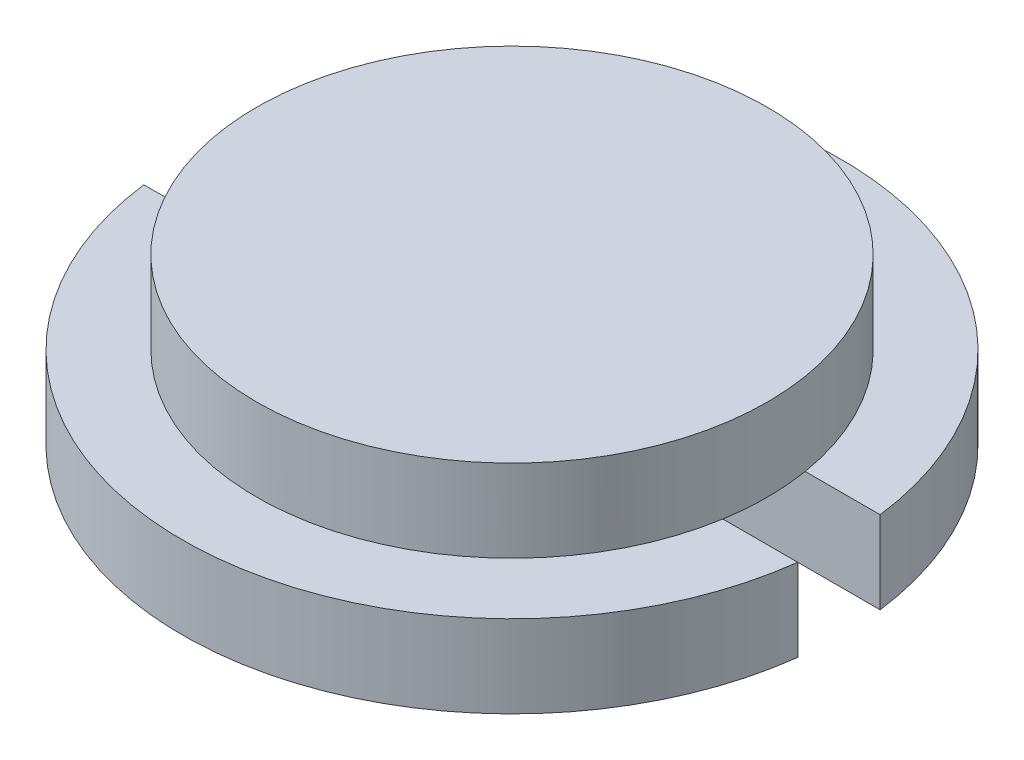
ISO-10303-21;
HEADER;
FILE_DESCRIPTION(('STEP AP214'),'2;1');
FILE_NAME('part.step','',(''),(''),'','','');
FILE_SCHEMA(('AUTOMOTIVE_DESIGN { 1 0 10303 214 1 1 1 1 }'));
ENDSEC;
DATA;
#1=APPLICATION_CONTEXT('core data for automotive mechanical design processes');
#2=APPLICATION_PROTOCOL_DEFINITION('international standard','automotive_design',2000,#1);
#3=PRODUCT_CONTEXT('',#1,'mechanical');
#4=PRODUCT('Part','Part','',(#3));
#5=PRODUCT_RELATED_PRODUCT_CATEGORY('part','',(#4));
#6=PRODUCT_DEFINITION_FORMATION('','',#4);
#7=PRODUCT_DEFINITION_CONTEXT('part definition',#1,'design');
#8=PRODUCT_DEFINITION('design','',#6,#7);
#9=PRODUCT_DEFINITION_SHAPE('','',#8);
#10=(LENGTH_UNIT() NAMED_UNIT(*) SI_UNIT(.MILLI.,.METRE.));
#11=(NAMED_UNIT(*) PLANE_ANGLE_UNIT() SI_UNIT($,.RADIAN.));
#12=(NAMED_UNIT(*) SI_UNIT($,.STERADIAN.) SOLID_ANGLE_UNIT());
#13=UNCERTAINTY_MEASURE_WITH_UNIT(LENGTH_MEASURE(1.E-05),#10,'distance_accuracy_value','');
#14=(GEOMETRIC_REPRESENTATION_CONTEXT(3) GLOBAL_UNCERTAINTY_ASSIGNED_CONTEXT((#13)) GLOBAL_UNIT_ASSIGNED_CONTEXT((#10,
#11,#12)) REPRESENTATION_CONTEXT('',''));
#15=CARTESIAN_POINT('',(0.,0.,0.));
#16=DIRECTION('',(0.,0.,1.));
#17=DIRECTION('',(1.,0.,0.));
#18=AXIS2_PLACEMENT_3D('',#15,#16,#17);
#19=CARTESIAN_POINT('',(0.,0.,0.));
#20=DIRECTION('',(0.,-1.,0.));
#21=DIRECTION('',(0.,0.,-1.));
#22=AXIS2_PLACEMENT_3D('',#19,#20,#21);
#23=PLANE('',#22);
#24=CARTESIAN_POINT('',(0.,0.,0.));
#25=DIRECTION('',(0.,-1.,0.));
#26=DIRECTION('',(0.,0.,-1.));
#27=AXIS2_PLACEMENT_3D('',#24,#25,#26);
#28=CIRCLE('',#27,40.);
#29=CARTESIAN_POINT('',(-39.6862696659689,0.,-5.));
#30=VERTEX_POINT('',#29);
#31=CARTESIAN_POINT('',(39.6862696659689,0.,-5.));
#32=VERTEX_POINT('',#31);
#33=EDGE_CURVE('E163',#30,#32,#28,.T.);
#34=ORIENTED_EDGE('',*,*,#33,.F.);
#35=DIRECTION('',(1.,0.,0.));
#36=VECTOR('',#35,1.);
#37=CARTESIAN_POINT('',(-39.6862696659689,0.,-5.));
#38=LINE('',#37,#36);
#39=CARTESIAN_POINT('',(-30.5941170815567,0.,-5.));
#40=VERTEX_POINT('',#39);
#41=EDGE_CURVE('E166',#30,#40,#38,.T.);
#42=ORIENTED_EDGE('',*,*,#41,.T.);
#43=CARTESIAN_POINT('',(0.,0.,0.));
#44=DIRECTION('',(0.,-1.,0.));
#45=DIRECTION('',(0.,0.,-1.));
#46=AXIS2_PLACEMENT_3D('',#43,#44,#45);
#47=CIRCLE('',#46,31.);
#48=CARTESIAN_POINT('',(30.5941170815567,0.,-5.));
#49=VERTEX_POINT('',#48);
#50=EDGE_CURVE('E179',#40,#49,#47,.T.);
#51=ORIENTED_EDGE('',*,*,#50,.T.);
#52=DIRECTION('',(1.,0.,0.));
#53=VECTOR('',#52,1.);
#54=CARTESIAN_POINT('',(22.5,0.,-5.));
#55=LINE('',#54,#53);
#56=EDGE_CURVE('E251',#49,#32,#55,.T.);
#57=ORIENTED_EDGE('',*,*,#56,.T.);
#58=EDGE_LOOP('',(#34,#42,#51,#57));
#59=FACE_BOUND('',#58,.T.);
#60=ADVANCED_FACE('F41',(#59),#23,.F.);
#61=CARTESIAN_POINT('',(0.,-10.,0.));
#62=DIRECTION('',(0.,1.,0.));
#63=DIRECTION('',(0.,0.,1.));
#64=AXIS2_PLACEMENT_3D('',#61,#62,#63);
#65=CYLINDRICAL_SURFACE('',#64,40.);
#66=CARTESIAN_POINT('',(0.,-10.,0.));
#67=DIRECTION('',(0.,-1.,0.));
#68=DIRECTION('',(0.,0.,-1.));
#69=AXIS2_PLACEMENT_3D('',#66,#67,#68);
#70=CIRCLE('',#69,40.);
#71=CARTESIAN_POINT('',(-39.6862696659689,-10.,-5.));
#72=VERTEX_POINT('',#71);
#73=CARTESIAN_POINT('',(39.6862696659689,-10.,-5.));
#74=VERTEX_POINT('',#73);
#75=EDGE_CURVE('E161',#72,#74,#70,.T.);
#76=ORIENTED_EDGE('',*,*,#75,.F.);
#77=DIRECTION('',(0.,1.,0.));
#78=VECTOR('',#77,1.);
#79=CARTESIAN_POINT('',(-39.6862696659689,-10.,-5.));
#80=LINE('',#79,#78);
#81=EDGE_CURVE('E265',#72,#30,#80,.T.);
#82=ORIENTED_EDGE('',*,*,#81,.T.);
#83=ORIENTED_EDGE('',*,*,#33,.T.);
#84=DIRECTION('',(0.,1.,0.));
#85=VECTOR('',#84,1.);
#86=CARTESIAN_POINT('',(39.6862696659689,-10.,-5.));
#87=LINE('',#86,#85);
#88=EDGE_CURVE('E148',#32,#74,#87,.F.);
#89=ORIENTED_EDGE('',*,*,#88,.T.);
#90=EDGE_LOOP('',(#76,#82,#83,#89));
#91=FACE_BOUND('',#90,.T.);
#92=ADVANCED_FACE('F159',(#91),#65,.T.);
#93=CARTESIAN_POINT('',(10.,-5.,10.));
#94=DIRECTION('',(-0.707106781186549,-0.707106781186546,0.));
#95=DIRECTION('',(0.707106781186546,-0.707106781186549,0.));
#96=AXIS2_PLACEMENT_3D('',#93,#94,#95);
#97=PLANE('',#96);
#98=DIRECTION('',(0.707106781186546,-0.707106781186549,0.));
#99=VECTOR('',#98,1.);
#100=CARTESIAN_POINT('',(10.,-5.,-5.));
#101=LINE('',#100,#99);
#102=CARTESIAN_POINT('',(10.,-5.,-5.));
#103=VERTEX_POINT('',#102);
#104=CARTESIAN_POINT('',(15.,-10.,-5.));
#105=VERTEX_POINT('',#104);
#106=EDGE_CURVE('E57',#103,#105,#101,.T.);
#107=ORIENTED_EDGE('',*,*,#106,.F.);
#108=DIRECTION('',(0.,0.,-1.));
#109=VECTOR('',#108,1.);
#110=CARTESIAN_POINT('',(10.,-5.,10.));
#111=LINE('',#110,#109);
#112=CARTESIAN_POINT('',(10.,-5.,5.));
#113=VERTEX_POINT('',#112);
#114=EDGE_CURVE('E209',#113,#103,#111,.T.);
#115=ORIENTED_EDGE('',*,*,#114,.F.);
#116=DIRECTION('',(-0.707106781186546,0.707106781186549,0.));
#117=VECTOR('',#116,1.);
#118=CARTESIAN_POINT('',(10.,-5.,5.));
#119=LINE('',#118,#117);
#120=CARTESIAN_POINT('',(15.,-10.,5.));
#121=VERTEX_POINT('',#120);
#122=EDGE_CURVE('E183',#121,#113,#119,.T.);
#123=ORIENTED_EDGE('',*,*,#122,.F.);
#124=DIRECTION('',(0.,0.,1.));
#125=VECTOR('',#124,1.);
#126=CARTESIAN_POINT('',(15.,-10.,0.));
#127=LINE('',#126,#125);
#128=EDGE_CURVE('E217',#105,#121,#127,.T.);
#129=ORIENTED_EDGE('',*,*,#128,.F.);
#130=EDGE_LOOP('',(#107,#115,#123,#129));
#131=FACE_BOUND('',#130,.T.);
#132=ADVANCED_FACE('F323',(#131),#97,.F.);
#133=CARTESIAN_POINT('',(10.,-5.,10.));
#134=DIRECTION('',(0.,-1.,0.));
#135=DIRECTION('',(1.,0.,0.));
#136=AXIS2_PLACEMENT_3D('',#133,#134,#135);
#137=PLANE('',#136);
#138=DIRECTION('',(1.,0.,0.));
#139=VECTOR('',#138,1.);
#140=CARTESIAN_POINT('',(10.,-5.,-5.));
#141=LINE('',#140,#139);
#142=CARTESIAN_POINT('',(5.00000000000001,-5.00000000000001,-5.));
#143=VERTEX_POINT('',#142);
#144=EDGE_CURVE('E64',#143,#103,#141,.T.);
#145=ORIENTED_EDGE('',*,*,#144,.F.);
#146=DIRECTION('',(0.,0.,-1.));
#147=VECTOR('',#146,1.);
#148=CARTESIAN_POINT('',(5.00000000000001,-5.00000000000001,10.));
#149=LINE('',#148,#147);
#150=CARTESIAN_POINT('',(5.00000000000001,-5.00000000000001,5.));
#151=VERTEX_POINT('',#150);
#152=EDGE_CURVE('E206',#151,#143,#149,.T.);
#153=ORIENTED_EDGE('',*,*,#152,.F.);
#154=DIRECTION('',(-1.,0.,0.));
#155=VECTOR('',#154,1.);
#156=CARTESIAN_POINT('',(10.,-5.,5.));
#157=LINE('',#156,#155);
#158=EDGE_CURVE('E316',#113,#151,#157,.T.);
#159=ORIENTED_EDGE('',*,*,#158,.F.);
#160=ORIENTED_EDGE('',*,*,#114,.T.);
#161=EDGE_LOOP('',(#145,#153,#159,#160));
#162=FACE_BOUND('',#161,.T.);
#163=ADVANCED_FACE('F324',(#162),#137,.F.);
#164=CARTESIAN_POINT('',(5.00000000000001,-5.00000000000001,10.));
#165=DIRECTION('',(-1.,0.,0.));
#166=DIRECTION('',(0.,0.,1.));
#167=AXIS2_PLACEMENT_3D('',#164,#165,#166);
#168=PLANE('',#167);
#169=DIRECTION('',(0.,-1.,0.));
#170=VECTOR('',#169,1.);
#171=CARTESIAN_POINT('',(5.00000000000001,-5.00000000000001,-5.));
#172=LINE('',#171,#170);
#173=CARTESIAN_POINT('',(5.00000000000001,0.,-5.));
#174=VERTEX_POINT('',#173);
#175=EDGE_CURVE('E286',#174,#143,#172,.T.);
#176=ORIENTED_EDGE('',*,*,#175,.F.);
#177=DIRECTION('',(0.,0.,-1.));
#178=VECTOR('',#177,1.);
#179=CARTESIAN_POINT('',(5.00000000000001,0.,10.));
#180=LINE('',#179,#178);
#181=CARTESIAN_POINT('',(5.00000000000001,0.,5.));
#182=VERTEX_POINT('',#181);
#183=EDGE_CURVE('E191',#182,#174,#180,.T.);
#184=ORIENTED_EDGE('',*,*,#183,.F.);
#185=DIRECTION('',(0.,1.,0.));
#186=VECTOR('',#185,1.);
#187=CARTESIAN_POINT('',(5.00000000000001,-5.00000000000001,5.));
#188=LINE('',#187,#186);
#189=EDGE_CURVE('E313',#151,#182,#188,.T.);
#190=ORIENTED_EDGE('',*,*,#189,.F.);
#191=ORIENTED_EDGE('',*,*,#152,.T.);
#192=EDGE_LOOP('',(#176,#184,#190,#191));
#193=FACE_BOUND('',#192,.T.);
#194=ADVANCED_FACE('F326',(#193),#168,.F.);
#195=CARTESIAN_POINT('',(-5.00000000000001,-5.00000000000001,10.));
#196=DIRECTION('',(1.,0.,0.));
#197=DIRECTION('',(0.,0.,-1.));
#198=AXIS2_PLACEMENT_3D('',#195,#196,#197);
#199=PLANE('',#198);
#200=DIRECTION('',(0.,1.,0.));
#201=VECTOR('',#200,1.);
#202=CARTESIAN_POINT('',(-5.00000000000001,-5.00000000000001,-5.));
#203=LINE('',#202,#201);
#204=CARTESIAN_POINT('',(-5.00000000000001,-5.00000000000001,-5.));
#205=VERTEX_POINT('',#204);
#206=CARTESIAN_POINT('',(-5.00000000000001,0.,-5.));
#207=VERTEX_POINT('',#206);
#208=EDGE_CURVE('E282',#205,#207,#203,.T.);
#209=ORIENTED_EDGE('',*,*,#208,.F.);
#210=DIRECTION('',(0.,0.,-1.));
#211=VECTOR('',#210,1.);
#212=CARTESIAN_POINT('',(-5.00000000000001,-5.00000000000001,10.));
#213=LINE('',#212,#211);
#214=CARTESIAN_POINT('',(-5.00000000000001,-5.00000000000001,5.));
#215=VERTEX_POINT('',#214);
#216=EDGE_CURVE('E198',#215,#205,#213,.T.);
#217=ORIENTED_EDGE('',*,*,#216,.F.);
#218=DIRECTION('',(0.,-1.,0.));
#219=VECTOR('',#218,1.);
#220=CARTESIAN_POINT('',(-5.00000000000001,-5.00000000000001,5.));
#221=LINE('',#220,#219);
#222=CARTESIAN_POINT('',(-5.00000000000001,0.,5.));
#223=VERTEX_POINT('',#222);
#224=EDGE_CURVE('E309',#223,#215,#221,.T.);
#225=ORIENTED_EDGE('',*,*,#224,.F.);
#226=DIRECTION('',(0.,0.,-1.));
#227=VECTOR('',#226,1.);
#228=CARTESIAN_POINT('',(-5.00000000000001,0.,10.));
#229=LINE('',#228,#227);
#230=EDGE_CURVE('E202',#223,#207,#229,.T.);
#231=ORIENTED_EDGE('',*,*,#230,.T.);
#232=EDGE_LOOP('',(#209,#217,#225,#231));
#233=FACE_BOUND('',#232,.T.);
#234=ADVANCED_FACE('F328',(#233),#199,.F.);
#235=CARTESIAN_POINT('',(-10.,-5.,10.));
#236=DIRECTION('',(0.,-1.,0.));
#237=DIRECTION('',(1.,0.,0.));
#238=AXIS2_PLACEMENT_3D('',#235,#236,#237);
#239=PLANE('',#238);
#240=DIRECTION('',(1.,0.,0.));
#241=VECTOR('',#240,1.);
#242=CARTESIAN_POINT('',(-10.,-5.,-5.));
#243=LINE('',#242,#241);
#244=CARTESIAN_POINT('',(-10.,-5.,-5.));
#245=VERTEX_POINT('',#244);
#246=EDGE_CURVE('E278',#245,#205,#243,.T.);
#247=ORIENTED_EDGE('',*,*,#246,.F.);
#248=DIRECTION('',(0.,0.,-1.));
#249=VECTOR('',#248,1.);
#250=CARTESIAN_POINT('',(-10.,-5.,10.));
#251=LINE('',#250,#249);
#252=CARTESIAN_POINT('',(-10.,-5.,5.));
#253=VERTEX_POINT('',#252);
#254=EDGE_CURVE('E193',#253,#245,#251,.T.);
#255=ORIENTED_EDGE('',*,*,#254,.F.);
#256=DIRECTION('',(-1.,0.,0.));
#257=VECTOR('',#256,1.);
#258=CARTESIAN_POINT('',(-10.,-5.,5.));
#259=LINE('',#258,#257);
#260=EDGE_CURVE('E305',#215,#253,#259,.T.);
#261=ORIENTED_EDGE('',*,*,#260,.F.);
#262=ORIENTED_EDGE('',*,*,#216,.T.);
#263=EDGE_LOOP('',(#247,#255,#261,#262));
#264=FACE_BOUND('',#263,.T.);
#265=ADVANCED_FACE('F334',(#264),#239,.F.);
#266=CARTESIAN_POINT('',(-10.,-5.,10.));
#267=DIRECTION('',(0.707106781186549,-0.707106781186546,0.));
#268=DIRECTION('',(0.707106781186546,0.707106781186549,0.));
#269=AXIS2_PLACEMENT_3D('',#266,#267,#268);
#270=PLANE('',#269);
#271=DIRECTION('',(0.707106781186546,0.707106781186549,0.));
#272=VECTOR('',#271,1.);
#273=CARTESIAN_POINT('',(-10.,-5.,-5.));
#274=LINE('',#273,#272);
#275=CARTESIAN_POINT('',(-15.,-10.,-5.));
#276=VERTEX_POINT('',#275);
#277=EDGE_CURVE('E272',#276,#245,#274,.T.);
#278=ORIENTED_EDGE('',*,*,#277,.F.);
#279=DIRECTION('',(0.,0.,-1.));
#280=VECTOR('',#279,1.);
#281=CARTESIAN_POINT('',(-15.,-10.,-10.));
#282=LINE('',#281,#280);
#283=CARTESIAN_POINT('',(-15.,-10.,5.));
#284=VERTEX_POINT('',#283);
#285=EDGE_CURVE('E197',#284,#276,#282,.T.);
#286=ORIENTED_EDGE('',*,*,#285,.F.);
#287=DIRECTION('',(-0.707106781186546,-0.707106781186549,0.));
#288=VECTOR('',#287,1.);
#289=CARTESIAN_POINT('',(-10.,-5.,5.));
#290=LINE('',#289,#288);
#291=EDGE_CURVE('E297',#253,#284,#290,.T.);
#292=ORIENTED_EDGE('',*,*,#291,.F.);
#293=ORIENTED_EDGE('',*,*,#254,.T.);
#294=EDGE_LOOP('',(#278,#286,#292,#293));
#295=FACE_BOUND('',#294,.T.);
#296=ADVANCED_FACE('F359',(#295),#270,.F.);
#297=CARTESIAN_POINT('',(0.,0.,0.));
#298=DIRECTION('',(0.,1.,0.));
#299=DIRECTION('',(0.,0.,1.));
#300=AXIS2_PLACEMENT_3D('',#297,#298,#299);
#301=PLANE('',#300);
#302=DIRECTION('',(1.,0.,0.));
#303=VECTOR('',#302,1.);
#304=CARTESIAN_POINT('',(0.,0.,-5.));
#305=LINE('',#304,#303);
#306=EDGE_CURVE('E240',#174,#49,#305,.T.);
#307=ORIENTED_EDGE('',*,*,#306,.T.);
#308=CARTESIAN_POINT('',(30.5941170815567,0.,5.));
#309=VERTEX_POINT('',#308);
#310=EDGE_CURVE('E187',#49,#309,#47,.T.);
#311=ORIENTED_EDGE('',*,*,#310,.T.);
#312=DIRECTION('',(-1.,0.,0.));
#313=VECTOR('',#312,1.);
#314=CARTESIAN_POINT('',(0.,0.,5.));
#315=LINE('',#314,#313);
#316=EDGE_CURVE('E237',#309,#182,#315,.T.);
#317=ORIENTED_EDGE('',*,*,#316,.T.);
#318=ORIENTED_EDGE('',*,*,#183,.T.);
#319=EDGE_LOOP('',(#307,#311,#317,#318));
#320=FACE_BOUND('',#319,.T.);
#321=ADVANCED_FACE('F236',(#320),#301,.F.);
#322=EDGE_CURVE('E270',#40,#207,#305,.T.);
#323=ORIENTED_EDGE('',*,*,#322,.T.);
#324=ORIENTED_EDGE('',*,*,#230,.F.);
#325=DIRECTION('',(1.,0.,0.));
#326=VECTOR('',#325,1.);
#327=CARTESIAN_POINT('',(0.,0.,5.));
#328=LINE('',#327,#326);
#329=CARTESIAN_POINT('',(-30.5941170815567,0.,5.));
#330=VERTEX_POINT('',#329);
#331=EDGE_CURVE('E11',#330,#223,#328,.T.);
#332=ORIENTED_EDGE('',*,*,#331,.F.);
#333=CARTESIAN_POINT('',(0.,0.,0.));
#334=DIRECTION('',(0.,1.,0.));
#335=DIRECTION('',(0.,0.,1.));
#336=AXIS2_PLACEMENT_3D('',#333,#334,#335);
#337=CIRCLE('',#336,31.);
#338=EDGE_CURVE('E154',#40,#330,#337,.T.);
#339=ORIENTED_EDGE('',*,*,#338,.F.);
#340=EDGE_LOOP('',(#323,#324,#332,#339));
#341=FACE_BOUND('',#340,.T.);
#342=ADVANCED_FACE('F227',(#341),#301,.F.);
#343=CARTESIAN_POINT('',(0.,10.,0.));
#344=DIRECTION('',(0.,-1.,0.));
#345=DIRECTION('',(0.,0.,-1.));
#346=AXIS2_PLACEMENT_3D('',#343,#344,#345);
#347=CYLINDRICAL_SURFACE('',#346,31.);
#348=CARTESIAN_POINT('',(0.,10.,0.));
#349=DIRECTION('',(0.,1.,0.));
#350=DIRECTION('',(0.,0.,1.));
#351=AXIS2_PLACEMENT_3D('',#348,#349,#350);
#352=CIRCLE('',#351,31.);
#353=CARTESIAN_POINT('',(0.,10.,31.));
#354=VERTEX_POINT('',#353);
#355=EDGE_CURVE('E50',#354,#354,#352,.T.);
#356=ORIENTED_EDGE('',*,*,#355,.F.);
#357=EDGE_LOOP('',(#356));
#358=FACE_BOUND('',#357,.T.);
#359=ORIENTED_EDGE('',*,*,#310,.F.);
#360=ORIENTED_EDGE('',*,*,#50,.F.);
#361=ORIENTED_EDGE('',*,*,#338,.T.);
#362=EDGE_CURVE('E192',#309,#330,#47,.T.);
#363=ORIENTED_EDGE('',*,*,#362,.F.);
#364=EDGE_LOOP('',(#359,#360,#361,#363));
#365=FACE_BOUND('',#364,.T.);
#366=ADVANCED_FACE('F43',(#358,#365),#347,.T.);
#367=CARTESIAN_POINT('',(0.,10.,0.));
#368=DIRECTION('',(0.,1.,0.));
#369=DIRECTION('',(0.,0.,1.));
#370=AXIS2_PLACEMENT_3D('',#367,#368,#369);
#371=PLANE('',#370);
#372=ORIENTED_EDGE('',*,*,#355,.T.);
#373=EDGE_LOOP('',(#372));
#374=FACE_BOUND('',#373,.T.);
#375=ADVANCED_FACE('F223',(#374),#371,.T.);
#376=ORIENTED_EDGE('',*,*,#362,.T.);
#377=DIRECTION('',(-1.,0.,0.));
#378=VECTOR('',#377,1.);
#379=CARTESIAN_POINT('',(-22.5,0.,5.));
#380=LINE('',#379,#378);
#381=CARTESIAN_POINT('',(-39.6862696659689,0.,5.));
#382=VERTEX_POINT('',#381);
#383=EDGE_CURVE('E250',#330,#382,#380,.T.);
#384=ORIENTED_EDGE('',*,*,#383,.T.);
#385=CARTESIAN_POINT('',(39.6862696659689,0.,5.));
#386=VERTEX_POINT('',#385);
#387=EDGE_CURVE('E174',#386,#382,#28,.T.);
#388=ORIENTED_EDGE('',*,*,#387,.F.);
#389=DIRECTION('',(-1.,0.,0.));
#390=VECTOR('',#389,1.);
#391=CARTESIAN_POINT('',(22.5,0.,5.));
#392=LINE('',#391,#390);
#393=EDGE_CURVE('E243',#386,#309,#392,.T.);
#394=ORIENTED_EDGE('',*,*,#393,.T.);
#395=EDGE_LOOP('',(#376,#384,#388,#394));
#396=FACE_BOUND('',#395,.T.);
#397=ADVANCED_FACE('F244',(#396),#23,.F.);
#398=ORIENTED_EDGE('',*,*,#387,.T.);
#399=DIRECTION('',(0.,1.,0.));
#400=VECTOR('',#399,1.);
#401=CARTESIAN_POINT('',(-39.6862696659689,-10.,5.));
#402=LINE('',#401,#400);
#403=CARTESIAN_POINT('',(-39.6862696659689,-10.,5.));
#404=VERTEX_POINT('',#403);
#405=EDGE_CURVE('E261',#382,#404,#402,.F.);
#406=ORIENTED_EDGE('',*,*,#405,.T.);
#407=CARTESIAN_POINT('',(39.6862696659689,-10.,5.));
#408=VERTEX_POINT('',#407);
#409=EDGE_CURVE('E173',#408,#404,#70,.T.);
#410=ORIENTED_EDGE('',*,*,#409,.F.);
#411=DIRECTION('',(0.,1.,0.));
#412=VECTOR('',#411,1.);
#413=CARTESIAN_POINT('',(39.6862696659689,-10.,5.));
#414=LINE('',#413,#412);
#415=EDGE_CURVE('E165',#408,#386,#414,.T.);
#416=ORIENTED_EDGE('',*,*,#415,.T.);
#417=EDGE_LOOP('',(#398,#406,#410,#416));
#418=FACE_BOUND('',#417,.T.);
#419=ADVANCED_FACE('F347',(#418),#65,.T.);
#420=CARTESIAN_POINT('',(0.,-10.,0.));
#421=DIRECTION('',(0.,1.,0.));
#422=DIRECTION('',(0.,0.,1.));
#423=AXIS2_PLACEMENT_3D('',#420,#421,#422);
#424=PLANE('',#423);
#425=DIRECTION('',(1.,0.,0.));
#426=VECTOR('',#425,1.);
#427=CARTESIAN_POINT('',(0.,-10.,-5.));
#428=LINE('',#427,#426);
#429=EDGE_CURVE('E153',#72,#276,#428,.T.);
#430=ORIENTED_EDGE('',*,*,#429,.F.);
#431=ORIENTED_EDGE('',*,*,#75,.T.);
#432=EDGE_CURVE('E144',#105,#74,#428,.T.);
#433=ORIENTED_EDGE('',*,*,#432,.F.);
#434=ORIENTED_EDGE('',*,*,#128,.T.);
#435=DIRECTION('',(-1.,0.,0.));
#436=VECTOR('',#435,1.);
#437=CARTESIAN_POINT('',(0.,-10.,5.));
#438=LINE('',#437,#436);
#439=EDGE_CURVE('E298',#408,#121,#438,.T.);
#440=ORIENTED_EDGE('',*,*,#439,.F.);
#441=ORIENTED_EDGE('',*,*,#409,.T.);
#442=EDGE_CURVE('E294',#284,#404,#438,.T.);
#443=ORIENTED_EDGE('',*,*,#442,.F.);
#444=ORIENTED_EDGE('',*,*,#285,.T.);
#445=EDGE_LOOP('',(#430,#431,#433,#434,#440,#441,#443,#444));
#446=FACE_BOUND('',#445,.T.);
#447=ADVANCED_FACE('F168',(#446),#424,.F.);
#448=CARTESIAN_POINT('',(0.,0.,5.));
#449=DIRECTION('',(0.,0.,1.));
#450=DIRECTION('',(1.,0.,0.));
#451=AXIS2_PLACEMENT_3D('',#448,#449,#450);
#452=PLANE('',#451);
#453=ORIENTED_EDGE('',*,*,#331,.T.);
#454=ORIENTED_EDGE('',*,*,#224,.T.);
#455=ORIENTED_EDGE('',*,*,#260,.T.);
#456=ORIENTED_EDGE('',*,*,#291,.T.);
#457=ORIENTED_EDGE('',*,*,#442,.T.);
#458=ORIENTED_EDGE('',*,*,#405,.F.);
#459=ORIENTED_EDGE('',*,*,#383,.F.);
#460=EDGE_LOOP('',(#453,#454,#455,#456,#457,#458,#459));
#461=FACE_BOUND('',#460,.T.);
#462=ADVANCED_FACE('F451',(#461),#452,.F.);
#463=ORIENTED_EDGE('',*,*,#439,.T.);
#464=ORIENTED_EDGE('',*,*,#122,.T.);
#465=ORIENTED_EDGE('',*,*,#158,.T.);
#466=ORIENTED_EDGE('',*,*,#189,.T.);
#467=ORIENTED_EDGE('',*,*,#316,.F.);
#468=ORIENTED_EDGE('',*,*,#393,.F.);
#469=ORIENTED_EDGE('',*,*,#415,.F.);
#470=EDGE_LOOP('',(#463,#464,#465,#466,#467,#468,#469));
#471=FACE_BOUND('',#470,.T.);
#472=ADVANCED_FACE('F322',(#471),#452,.F.);
#473=CARTESIAN_POINT('',(0.,0.,-5.));
#474=DIRECTION('',(0.,0.,-1.));
#475=DIRECTION('',(-1.,0.,0.));
#476=AXIS2_PLACEMENT_3D('',#473,#474,#475);
#477=PLANE('',#476);
#478=ORIENTED_EDGE('',*,*,#246,.T.);
#479=ORIENTED_EDGE('',*,*,#208,.T.);
#480=ORIENTED_EDGE('',*,*,#322,.F.);
#481=ORIENTED_EDGE('',*,*,#41,.F.);
#482=ORIENTED_EDGE('',*,*,#81,.F.);
#483=ORIENTED_EDGE('',*,*,#429,.T.);
#484=ORIENTED_EDGE('',*,*,#277,.T.);
#485=EDGE_LOOP('',(#478,#479,#480,#481,#482,#483,#484));
#486=FACE_BOUND('',#485,.T.);
#487=ADVANCED_FACE('F469',(#486),#477,.F.);
#488=ORIENTED_EDGE('',*,*,#144,.T.);
#489=ORIENTED_EDGE('',*,*,#106,.T.);
#490=ORIENTED_EDGE('',*,*,#432,.T.);
#491=ORIENTED_EDGE('',*,*,#88,.F.);
#492=ORIENTED_EDGE('',*,*,#56,.F.);
#493=ORIENTED_EDGE('',*,*,#306,.F.);
#494=ORIENTED_EDGE('',*,*,#175,.T.);
#495=EDGE_LOOP('',(#488,#489,#490,#491,#492,#493,#494));
#496=FACE_BOUND('',#495,.T.);
#497=ADVANCED_FACE('F146',(#496),#477,.F.);
#498=CLOSED_SHELL('',(#60,#92,#132,#163,#194,#234,#265,#296,#321,#342,#366,#375,#397,#419,#447,
#462,#472,#487,#497));
#499=MANIFOLD_SOLID_BREP('B2',#498);
#500=ADVANCED_BREP_SHAPE_REPRESENTATION('',(#18,#499),#14);
#501=SHAPE_DEFINITION_REPRESENTATION(#9,#500);
ENDSEC;
END-ISO-10303-21;
